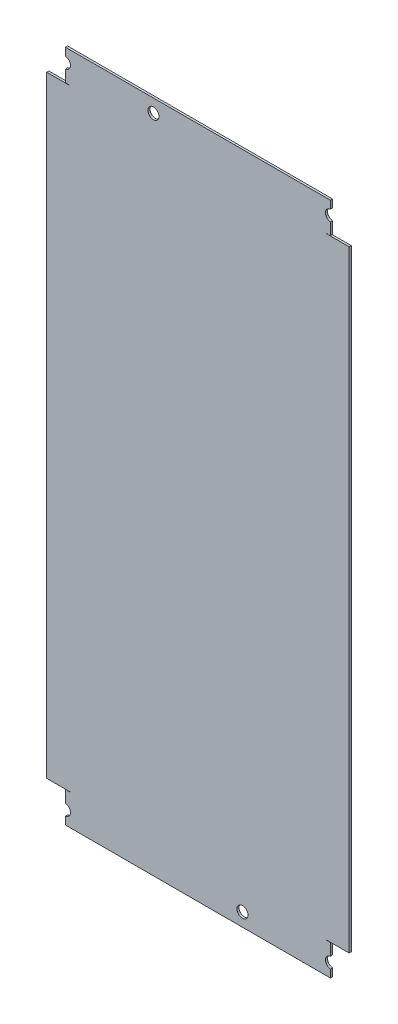
ISO-10303-21;
HEADER;
FILE_DESCRIPTION(('STEP AP214'),'2;1');
FILE_NAME('part.step','',(''),(''),'','','');
FILE_SCHEMA(('AUTOMOTIVE_DESIGN { 1 0 10303 214 1 1 1 1 }'));
ENDSEC;
DATA;
#1=APPLICATION_CONTEXT('core data for automotive mechanical design processes');
#2=APPLICATION_PROTOCOL_DEFINITION('international standard','automotive_design',2000,#1);
#3=PRODUCT_CONTEXT('',#1,'mechanical');
#4=PRODUCT('Part','Part','',(#3));
#5=PRODUCT_RELATED_PRODUCT_CATEGORY('part','',(#4));
#6=PRODUCT_DEFINITION_FORMATION('','',#4);
#7=PRODUCT_DEFINITION_CONTEXT('part definition',#1,'design');
#8=PRODUCT_DEFINITION('design','',#6,#7);
#9=PRODUCT_DEFINITION_SHAPE('','',#8);
#10=(LENGTH_UNIT() NAMED_UNIT(*) SI_UNIT(.MILLI.,.METRE.));
#11=(NAMED_UNIT(*) PLANE_ANGLE_UNIT() SI_UNIT($,.RADIAN.));
#12=(NAMED_UNIT(*) SI_UNIT($,.STERADIAN.) SOLID_ANGLE_UNIT());
#13=UNCERTAINTY_MEASURE_WITH_UNIT(LENGTH_MEASURE(1.E-05),#10,'distance_accuracy_value','');
#14=(GEOMETRIC_REPRESENTATION_CONTEXT(3) GLOBAL_UNCERTAINTY_ASSIGNED_CONTEXT((#13)) GLOBAL_UNIT_ASSIGNED_CONTEXT((#10,
#11,#12)) REPRESENTATION_CONTEXT('',''));
#15=CARTESIAN_POINT('',(0.,0.,0.));
#16=DIRECTION('',(0.,0.,1.));
#17=DIRECTION('',(1.,0.,0.));
#18=AXIS2_PLACEMENT_3D('',#15,#16,#17);
#19=CARTESIAN_POINT('',(0.,0.,-1.524));
#20=DIRECTION('',(0.,0.,-1.));
#21=DIRECTION('',(-1.,0.,0.));
#22=AXIS2_PLACEMENT_3D('',#19,#20,#21);
#23=PLANE('',#22);
#24=CARTESIAN_POINT('',(31.877,-231.775,-1.524));
#25=DIRECTION('',(0.,0.,1.));
#26=DIRECTION('',(1.,0.,0.));
#27=AXIS2_PLACEMENT_3D('',#24,#25,#26);
#28=CIRCLE('',#27,3.96240000000001);
#29=CARTESIAN_POINT('',(35.8394,-231.775,-1.524));
#30=VERTEX_POINT('',#29);
#31=EDGE_CURVE('E504',#30,#30,#28,.T.);
#32=ORIENTED_EDGE('',*,*,#31,.T.);
#33=EDGE_LOOP('',(#32));
#34=FACE_BOUND('',#33,.T.);
#35=CARTESIAN_POINT('',(-31.877,231.775,-1.524));
#36=DIRECTION('',(0.,0.,1.));
#37=DIRECTION('',(1.,0.,0.));
#38=AXIS2_PLACEMENT_3D('',#35,#36,#37);
#39=CIRCLE('',#38,3.96240000000001);
#40=CARTESIAN_POINT('',(-27.9146,231.775,-1.524));
#41=VERTEX_POINT('',#40);
#42=EDGE_CURVE('E512',#41,#41,#39,.T.);
#43=ORIENTED_EDGE('',*,*,#42,.T.);
#44=EDGE_LOOP('',(#43));
#45=FACE_BOUND('',#44,.T.);
#46=DIRECTION('',(0.,1.,0.));
#47=VECTOR('',#46,1.);
#48=CARTESIAN_POINT('',(94.869,-241.3,-1.524));
#49=LINE('',#48,#47);
#50=CARTESIAN_POINT('',(94.869,235.716503875426,-1.52400000000002));
#51=VERTEX_POINT('',#50);
#52=CARTESIAN_POINT('',(94.869,241.3,-1.524));
#53=VERTEX_POINT('',#52);
#54=EDGE_CURVE('E526',#51,#53,#49,.T.);
#55=ORIENTED_EDGE('',*,*,#54,.F.);
#56=CARTESIAN_POINT('',(95.2754000000001,231.775,-1.52400000000002));
#57=DIRECTION('',(0.,0.,1.));
#58=DIRECTION('',(1.,0.,0.));
#59=AXIS2_PLACEMENT_3D('',#56,#57,#58);
#60=CIRCLE('',#59,3.9624);
#61=CARTESIAN_POINT('',(94.869,227.833496124574,-1.52400000000002));
#62=VERTEX_POINT('',#61);
#63=EDGE_CURVE('E354',#62,#51,#60,.F.);
#64=ORIENTED_EDGE('',*,*,#63,.F.);
#65=CARTESIAN_POINT('',(94.869,219.2274,-1.524));
#66=VERTEX_POINT('',#65);
#67=EDGE_CURVE('E527',#66,#62,#49,.T.);
#68=ORIENTED_EDGE('',*,*,#67,.F.);
#69=DIRECTION('',(-1.,0.,0.));
#70=VECTOR('',#69,1.);
#71=CARTESIAN_POINT('',(0.,219.2274,-1.524));
#72=LINE('',#71,#70);
#73=CARTESIAN_POINT('',(91.6686,219.2274,-1.524));
#74=VERTEX_POINT('',#73);
#75=EDGE_CURVE('E500',#66,#74,#72,.T.);
#76=ORIENTED_EDGE('',*,*,#75,.T.);
#77=DIRECTION('',(0.,-1.,0.));
#78=VECTOR('',#77,1.);
#79=CARTESIAN_POINT('',(91.6686,0.,-1.524));
#80=LINE('',#79,#78);
#81=CARTESIAN_POINT('',(91.6686,219.075,-1.524));
#82=VERTEX_POINT('',#81);
#83=EDGE_CURVE('E497',#74,#82,#80,.T.);
#84=ORIENTED_EDGE('',*,*,#83,.T.);
#85=DIRECTION('',(1.,0.,0.));
#86=VECTOR('',#85,1.);
#87=CARTESIAN_POINT('',(0.,219.075,-1.524));
#88=LINE('',#87,#86);
#89=CARTESIAN_POINT('',(108.317962531012,219.075,-1.52400000000008));
#90=VERTEX_POINT('',#89);
#91=EDGE_CURVE('E494',#82,#90,#88,.T.);
#92=ORIENTED_EDGE('',*,*,#91,.T.);
#93=DIRECTION('',(0.,-1.,0.));
#94=VECTOR('',#93,1.);
#95=CARTESIAN_POINT('',(108.317962531012,0.,-1.52400000000009));
#96=LINE('',#95,#94);
#97=CARTESIAN_POINT('',(108.317962531012,-219.075,-1.52400000000011));
#98=VERTEX_POINT('',#97);
#99=EDGE_CURVE('E299',#90,#98,#96,.T.);
#100=ORIENTED_EDGE('',*,*,#99,.T.);
#101=DIRECTION('',(-1.,0.,0.));
#102=VECTOR('',#101,1.);
#103=CARTESIAN_POINT('',(0.,-219.075,-1.524));
#104=LINE('',#103,#102);
#105=CARTESIAN_POINT('',(91.6686,-219.075,-1.524));
#106=VERTEX_POINT('',#105);
#107=EDGE_CURVE('E491',#98,#106,#104,.T.);
#108=ORIENTED_EDGE('',*,*,#107,.T.);
#109=DIRECTION('',(0.,-1.,0.));
#110=VECTOR('',#109,1.);
#111=CARTESIAN_POINT('',(91.6686,0.,-1.524));
#112=LINE('',#111,#110);
#113=CARTESIAN_POINT('',(91.6686,-219.2274,-1.524));
#114=VERTEX_POINT('',#113);
#115=EDGE_CURVE('E488',#106,#114,#112,.T.);
#116=ORIENTED_EDGE('',*,*,#115,.T.);
#117=DIRECTION('',(1.,0.,0.));
#118=VECTOR('',#117,1.);
#119=CARTESIAN_POINT('',(0.,-219.2274,-1.524));
#120=LINE('',#119,#118);
#121=CARTESIAN_POINT('',(94.869,-219.2274,-1.524));
#122=VERTEX_POINT('',#121);
#123=EDGE_CURVE('E452',#114,#122,#120,.T.);
#124=ORIENTED_EDGE('',*,*,#123,.T.);
#125=CARTESIAN_POINT('',(94.869,-227.833496124573,-1.52400000000002));
#126=VERTEX_POINT('',#125);
#127=EDGE_CURVE('E525',#126,#122,#49,.T.);
#128=ORIENTED_EDGE('',*,*,#127,.F.);
#129=CARTESIAN_POINT('',(95.2753999999999,-231.775,-1.52400000000002));
#130=DIRECTION('',(0.,0.,1.));
#131=DIRECTION('',(1.,0.,0.));
#132=AXIS2_PLACEMENT_3D('',#129,#130,#131);
#133=CIRCLE('',#132,3.96240000000001);
#134=CARTESIAN_POINT('',(94.869,-235.716503875426,-1.52400000000002));
#135=VERTEX_POINT('',#134);
#136=EDGE_CURVE('E340',#135,#126,#133,.F.);
#137=ORIENTED_EDGE('',*,*,#136,.F.);
#138=CARTESIAN_POINT('',(94.869,-241.3,-1.524));
#139=VERTEX_POINT('',#138);
#140=EDGE_CURVE('E520',#139,#135,#49,.T.);
#141=ORIENTED_EDGE('',*,*,#140,.F.);
#142=DIRECTION('',(1.,0.,0.));
#143=VECTOR('',#142,1.);
#144=CARTESIAN_POINT('',(-94.869,-241.3,-1.524));
#145=LINE('',#144,#143);
#146=CARTESIAN_POINT('',(-94.869,-241.3,-1.524));
#147=VERTEX_POINT('',#146);
#148=EDGE_CURVE('E536',#147,#139,#145,.T.);
#149=ORIENTED_EDGE('',*,*,#148,.F.);
#150=DIRECTION('',(0.,-1.,0.));
#151=VECTOR('',#150,1.);
#152=CARTESIAN_POINT('',(-94.869,-241.3,-1.524));
#153=LINE('',#152,#151);
#154=CARTESIAN_POINT('',(-94.869,-235.716503875426,-1.52400000000002));
#155=VERTEX_POINT('',#154);
#156=EDGE_CURVE('E531',#155,#147,#153,.T.);
#157=ORIENTED_EDGE('',*,*,#156,.F.);
#158=CARTESIAN_POINT('',(-95.2754,-231.775,-1.52400000000002));
#159=DIRECTION('',(0.,0.,1.));
#160=DIRECTION('',(1.,0.,0.));
#161=AXIS2_PLACEMENT_3D('',#158,#159,#160);
#162=CIRCLE('',#161,3.96240000000001);
#163=CARTESIAN_POINT('',(-94.869,-227.833496124574,-1.52400000000002));
#164=VERTEX_POINT('',#163);
#165=EDGE_CURVE('E327',#155,#164,#162,.T.);
#166=ORIENTED_EDGE('',*,*,#165,.T.);
#167=CARTESIAN_POINT('',(-94.869,-219.2274,-1.524));
#168=VERTEX_POINT('',#167);
#169=EDGE_CURVE('E538',#168,#164,#153,.T.);
#170=ORIENTED_EDGE('',*,*,#169,.F.);
#171=DIRECTION('',(1.,0.,0.));
#172=VECTOR('',#171,1.);
#173=CARTESIAN_POINT('',(0.,-219.2274,-1.524));
#174=LINE('',#173,#172);
#175=CARTESIAN_POINT('',(-91.6686,-219.2274,-1.524));
#176=VERTEX_POINT('',#175);
#177=EDGE_CURVE('E428',#168,#176,#174,.T.);
#178=ORIENTED_EDGE('',*,*,#177,.T.);
#179=DIRECTION('',(0.,1.,0.));
#180=VECTOR('',#179,1.);
#181=CARTESIAN_POINT('',(-91.6686,0.,-1.524));
#182=LINE('',#181,#180);
#183=CARTESIAN_POINT('',(-91.6686,-219.075,-1.524));
#184=VERTEX_POINT('',#183);
#185=EDGE_CURVE('E443',#176,#184,#182,.T.);
#186=ORIENTED_EDGE('',*,*,#185,.T.);
#187=DIRECTION('',(-1.,0.,0.));
#188=VECTOR('',#187,1.);
#189=CARTESIAN_POINT('',(0.,-219.075,-1.524));
#190=LINE('',#189,#188);
#191=CARTESIAN_POINT('',(-108.317962531012,-219.075,-1.52400000000014));
#192=VERTEX_POINT('',#191);
#193=EDGE_CURVE('E440',#184,#192,#190,.T.);
#194=ORIENTED_EDGE('',*,*,#193,.T.);
#195=DIRECTION('',(0.,1.,0.));
#196=VECTOR('',#195,1.);
#197=CARTESIAN_POINT('',(-108.317962531012,0.,-1.52400000000012));
#198=LINE('',#197,#196);
#199=CARTESIAN_POINT('',(-108.317962531012,219.075,-1.52400000000011));
#200=VERTEX_POINT('',#199);
#201=EDGE_CURVE('E314',#192,#200,#198,.T.);
#202=ORIENTED_EDGE('',*,*,#201,.T.);
#203=DIRECTION('',(1.,0.,0.));
#204=VECTOR('',#203,1.);
#205=CARTESIAN_POINT('',(0.,219.075,-1.524));
#206=LINE('',#205,#204);
#207=CARTESIAN_POINT('',(-91.6686,219.075,-1.524));
#208=VERTEX_POINT('',#207);
#209=EDGE_CURVE('E436',#200,#208,#206,.T.);
#210=ORIENTED_EDGE('',*,*,#209,.T.);
#211=DIRECTION('',(0.,1.,0.));
#212=VECTOR('',#211,1.);
#213=CARTESIAN_POINT('',(-91.6686,0.,-1.524));
#214=LINE('',#213,#212);
#215=CARTESIAN_POINT('',(-91.6686,219.2274,-1.524));
#216=VERTEX_POINT('',#215);
#217=EDGE_CURVE('E432',#208,#216,#214,.T.);
#218=ORIENTED_EDGE('',*,*,#217,.T.);
#219=DIRECTION('',(-1.,0.,0.));
#220=VECTOR('',#219,1.);
#221=CARTESIAN_POINT('',(0.,219.2274,-1.524));
#222=LINE('',#221,#220);
#223=CARTESIAN_POINT('',(-94.869,219.2274,-1.524));
#224=VERTEX_POINT('',#223);
#225=EDGE_CURVE('E382',#216,#224,#222,.T.);
#226=ORIENTED_EDGE('',*,*,#225,.T.);
#227=CARTESIAN_POINT('',(-94.869,227.833496124574,-1.52400000000002));
#228=VERTEX_POINT('',#227);
#229=EDGE_CURVE('E537',#228,#224,#153,.T.);
#230=ORIENTED_EDGE('',*,*,#229,.F.);
#231=CARTESIAN_POINT('',(-95.2754,231.775,-1.52400000000002));
#232=DIRECTION('',(0.,0.,1.));
#233=DIRECTION('',(1.,0.,0.));
#234=AXIS2_PLACEMENT_3D('',#231,#232,#233);
#235=CIRCLE('',#234,3.96240000000001);
#236=CARTESIAN_POINT('',(-94.869,235.716503875426,-1.52400000000002));
#237=VERTEX_POINT('',#236);
#238=EDGE_CURVE('E365',#228,#237,#235,.T.);
#239=ORIENTED_EDGE('',*,*,#238,.T.);
#240=CARTESIAN_POINT('',(-94.869,241.3,-1.524));
#241=VERTEX_POINT('',#240);
#242=EDGE_CURVE('E532',#241,#237,#153,.T.);
#243=ORIENTED_EDGE('',*,*,#242,.F.);
#244=DIRECTION('',(-1.,0.,0.));
#245=VECTOR('',#244,1.);
#246=CARTESIAN_POINT('',(-94.869,241.3,-1.524));
#247=LINE('',#246,#245);
#248=EDGE_CURVE('E524',#53,#241,#247,.T.);
#249=ORIENTED_EDGE('',*,*,#248,.F.);
#250=EDGE_LOOP('',(#55,#64,#68,#76,#84,#92,#100,#108,#116,#124,#128,#137,#141,#149,#157,#166,
#170,#178,#186,#194,#202,#210,#218,#226,#230,#239,#243,#249));
#251=FACE_BOUND('',#250,.T.);
#252=ADVANCED_FACE('F91',(#34,#45,#251),#23,.T.);
#253=CARTESIAN_POINT('',(0.,0.,0.));
#254=DIRECTION('',(0.,0.,-1.));
#255=DIRECTION('',(-1.,0.,0.));
#256=AXIS2_PLACEMENT_3D('',#253,#254,#255);
#257=PLANE('',#256);
#258=CARTESIAN_POINT('',(31.877,-231.775,0.));
#259=DIRECTION('',(0.,0.,1.));
#260=DIRECTION('',(1.,0.,0.));
#261=AXIS2_PLACEMENT_3D('',#258,#259,#260);
#262=CIRCLE('',#261,3.96240000000001);
#263=CARTESIAN_POINT('',(35.8394,-231.775,0.));
#264=VERTEX_POINT('',#263);
#265=EDGE_CURVE('E503',#264,#264,#262,.T.);
#266=ORIENTED_EDGE('',*,*,#265,.F.);
#267=EDGE_LOOP('',(#266));
#268=FACE_BOUND('',#267,.T.);
#269=CARTESIAN_POINT('',(-31.877,231.775,0.));
#270=DIRECTION('',(0.,0.,1.));
#271=DIRECTION('',(1.,0.,0.));
#272=AXIS2_PLACEMENT_3D('',#269,#270,#271);
#273=CIRCLE('',#272,3.96240000000001);
#274=CARTESIAN_POINT('',(-27.9146,231.775,0.));
#275=VERTEX_POINT('',#274);
#276=EDGE_CURVE('E508',#275,#275,#273,.T.);
#277=ORIENTED_EDGE('',*,*,#276,.F.);
#278=EDGE_LOOP('',(#277));
#279=FACE_BOUND('',#278,.T.);
#280=CARTESIAN_POINT('',(95.2754000000001,231.775,0.));
#281=DIRECTION('',(0.,0.,1.));
#282=DIRECTION('',(1.,0.,0.));
#283=AXIS2_PLACEMENT_3D('',#280,#281,#282);
#284=CIRCLE('',#283,3.9624);
#285=CARTESIAN_POINT('',(94.869,227.833496124574,0.));
#286=VERTEX_POINT('',#285);
#287=CARTESIAN_POINT('',(94.869,235.716503875426,0.));
#288=VERTEX_POINT('',#287);
#289=EDGE_CURVE('E313',#286,#288,#284,.F.);
#290=ORIENTED_EDGE('',*,*,#289,.T.);
#291=DIRECTION('',(0.,1.,0.));
#292=VECTOR('',#291,1.);
#293=CARTESIAN_POINT('',(94.869,-241.3,0.));
#294=LINE('',#293,#292);
#295=CARTESIAN_POINT('',(94.869,241.3,0.));
#296=VERTEX_POINT('',#295);
#297=EDGE_CURVE('E516',#288,#296,#294,.T.);
#298=ORIENTED_EDGE('',*,*,#297,.T.);
#299=DIRECTION('',(-1.,0.,0.));
#300=VECTOR('',#299,1.);
#301=CARTESIAN_POINT('',(-94.869,241.3,0.));
#302=LINE('',#301,#300);
#303=CARTESIAN_POINT('',(-94.869,241.3,0.));
#304=VERTEX_POINT('',#303);
#305=EDGE_CURVE('E546',#296,#304,#302,.T.);
#306=ORIENTED_EDGE('',*,*,#305,.T.);
#307=DIRECTION('',(0.,-1.,0.));
#308=VECTOR('',#307,1.);
#309=CARTESIAN_POINT('',(-94.869,-241.3,0.));
#310=LINE('',#309,#308);
#311=CARTESIAN_POINT('',(-94.869,235.716503875426,0.));
#312=VERTEX_POINT('',#311);
#313=EDGE_CURVE('E553',#304,#312,#310,.T.);
#314=ORIENTED_EDGE('',*,*,#313,.T.);
#315=CARTESIAN_POINT('',(-95.2754,231.775,0.));
#316=DIRECTION('',(0.,0.,1.));
#317=DIRECTION('',(1.,0.,0.));
#318=AXIS2_PLACEMENT_3D('',#315,#316,#317);
#319=CIRCLE('',#318,3.96240000000001);
#320=CARTESIAN_POINT('',(-94.869,227.833496124574,0.));
#321=VERTEX_POINT('',#320);
#322=EDGE_CURVE('E117',#321,#312,#319,.T.);
#323=ORIENTED_EDGE('',*,*,#322,.F.);
#324=CARTESIAN_POINT('',(-94.869,219.2274,0.));
#325=VERTEX_POINT('',#324);
#326=EDGE_CURVE('E558',#321,#325,#310,.T.);
#327=ORIENTED_EDGE('',*,*,#326,.T.);
#328=DIRECTION('',(-1.,0.,0.));
#329=VECTOR('',#328,1.);
#330=CARTESIAN_POINT('',(-91.6686,219.2274,0.));
#331=LINE('',#330,#329);
#332=CARTESIAN_POINT('',(-91.6686,219.2274,0.));
#333=VERTEX_POINT('',#332);
#334=EDGE_CURVE('E402',#333,#325,#331,.T.);
#335=ORIENTED_EDGE('',*,*,#334,.F.);
#336=DIRECTION('',(0.,1.,0.));
#337=VECTOR('',#336,1.);
#338=CARTESIAN_POINT('',(-91.6686,219.075,0.));
#339=LINE('',#338,#337);
#340=CARTESIAN_POINT('',(-91.6686,219.075,0.));
#341=VERTEX_POINT('',#340);
#342=EDGE_CURVE('E397',#341,#333,#339,.T.);
#343=ORIENTED_EDGE('',*,*,#342,.F.);
#344=DIRECTION('',(1.,0.,0.));
#345=VECTOR('',#344,1.);
#346=CARTESIAN_POINT('',(-91.821,219.075,0.));
#347=LINE('',#346,#345);
#348=CARTESIAN_POINT('',(-108.317962531012,219.075,-1.11022302462516E-13));
#349=VERTEX_POINT('',#348);
#350=EDGE_CURVE('E393',#349,#341,#347,.T.);
#351=ORIENTED_EDGE('',*,*,#350,.F.);
#352=DIRECTION('',(0.,-1.,0.));
#353=VECTOR('',#352,1.);
#354=CARTESIAN_POINT('',(-108.317962531012,219.075,-1.11022302462516E-13));
#355=LINE('',#354,#353);
#356=CARTESIAN_POINT('',(-108.317962531012,-219.075,-1.38777878078145E-13));
#357=VERTEX_POINT('',#356);
#358=EDGE_CURVE('E322',#357,#349,#355,.F.);
#359=ORIENTED_EDGE('',*,*,#358,.F.);
#360=DIRECTION('',(-1.,0.,0.));
#361=VECTOR('',#360,1.);
#362=CARTESIAN_POINT('',(-91.6686,-219.075,0.));
#363=LINE('',#362,#361);
#364=CARTESIAN_POINT('',(-91.6686,-219.075,0.));
#365=VERTEX_POINT('',#364);
#366=EDGE_CURVE('E389',#365,#357,#363,.T.);
#367=ORIENTED_EDGE('',*,*,#366,.F.);
#368=DIRECTION('',(0.,1.,0.));
#369=VECTOR('',#368,1.);
#370=CARTESIAN_POINT('',(-91.6686,-219.2274,0.));
#371=LINE('',#370,#369);
#372=CARTESIAN_POINT('',(-91.6686,-219.2274,0.));
#373=VERTEX_POINT('',#372);
#374=EDGE_CURVE('E384',#373,#365,#371,.T.);
#375=ORIENTED_EDGE('',*,*,#374,.F.);
#376=DIRECTION('',(1.,0.,0.));
#377=VECTOR('',#376,1.);
#378=CARTESIAN_POINT('',(-94.869,-219.2274,0.));
#379=LINE('',#378,#377);
#380=CARTESIAN_POINT('',(-94.869,-219.2274,0.));
#381=VERTEX_POINT('',#380);
#382=EDGE_CURVE('E378',#381,#373,#379,.T.);
#383=ORIENTED_EDGE('',*,*,#382,.F.);
#384=CARTESIAN_POINT('',(-94.869,-227.833496124574,0.));
#385=VERTEX_POINT('',#384);
#386=EDGE_CURVE('E559',#381,#385,#310,.T.);
#387=ORIENTED_EDGE('',*,*,#386,.T.);
#388=CARTESIAN_POINT('',(-95.2754,-231.775,0.));
#389=DIRECTION('',(0.,0.,1.));
#390=DIRECTION('',(1.,0.,0.));
#391=AXIS2_PLACEMENT_3D('',#388,#389,#390);
#392=CIRCLE('',#391,3.96240000000001);
#393=CARTESIAN_POINT('',(-94.869,-235.716503875426,0.));
#394=VERTEX_POINT('',#393);
#395=EDGE_CURVE('E109',#394,#385,#392,.T.);
#396=ORIENTED_EDGE('',*,*,#395,.F.);
#397=CARTESIAN_POINT('',(-94.869,-241.3,0.));
#398=VERTEX_POINT('',#397);
#399=EDGE_CURVE('E552',#394,#398,#310,.T.);
#400=ORIENTED_EDGE('',*,*,#399,.T.);
#401=DIRECTION('',(1.,0.,0.));
#402=VECTOR('',#401,1.);
#403=CARTESIAN_POINT('',(-94.869,-241.3,0.));
#404=LINE('',#403,#402);
#405=CARTESIAN_POINT('',(94.869,-241.3,0.));
#406=VERTEX_POINT('',#405);
#407=EDGE_CURVE('E557',#398,#406,#404,.T.);
#408=ORIENTED_EDGE('',*,*,#407,.T.);
#409=CARTESIAN_POINT('',(94.869,-235.716503875426,0.));
#410=VERTEX_POINT('',#409);
#411=EDGE_CURVE('E542',#406,#410,#294,.T.);
#412=ORIENTED_EDGE('',*,*,#411,.T.);
#413=CARTESIAN_POINT('',(95.2753999999999,-231.775,0.));
#414=DIRECTION('',(0.,0.,1.));
#415=DIRECTION('',(1.,0.,0.));
#416=AXIS2_PLACEMENT_3D('',#413,#414,#415);
#417=CIRCLE('',#416,3.96240000000001);
#418=CARTESIAN_POINT('',(94.869,-227.833496124573,0.));
#419=VERTEX_POINT('',#418);
#420=EDGE_CURVE('E344',#410,#419,#417,.F.);
#421=ORIENTED_EDGE('',*,*,#420,.T.);
#422=CARTESIAN_POINT('',(94.869,-219.2274,0.));
#423=VERTEX_POINT('',#422);
#424=EDGE_CURVE('E547',#419,#423,#294,.T.);
#425=ORIENTED_EDGE('',*,*,#424,.T.);
#426=DIRECTION('',(1.,0.,0.));
#427=VECTOR('',#426,1.);
#428=CARTESIAN_POINT('',(91.6686,-219.2274,0.));
#429=LINE('',#428,#427);
#430=CARTESIAN_POINT('',(91.6686,-219.2274,0.));
#431=VERTEX_POINT('',#430);
#432=EDGE_CURVE('E464',#431,#423,#429,.T.);
#433=ORIENTED_EDGE('',*,*,#432,.F.);
#434=DIRECTION('',(0.,-1.,0.));
#435=VECTOR('',#434,1.);
#436=CARTESIAN_POINT('',(91.6686,-219.075,0.));
#437=LINE('',#436,#435);
#438=CARTESIAN_POINT('',(91.6686,-219.075,0.));
#439=VERTEX_POINT('',#438);
#440=EDGE_CURVE('E459',#439,#431,#437,.T.);
#441=ORIENTED_EDGE('',*,*,#440,.F.);
#442=DIRECTION('',(-1.,0.,0.));
#443=VECTOR('',#442,1.);
#444=CARTESIAN_POINT('',(91.821,-219.075,0.));
#445=LINE('',#444,#443);
#446=CARTESIAN_POINT('',(108.317962531012,-219.075,-1.11022302462516E-13));
#447=VERTEX_POINT('',#446);
#448=EDGE_CURVE('E304',#447,#439,#445,.T.);
#449=ORIENTED_EDGE('',*,*,#448,.F.);
#450=DIRECTION('',(0.,1.,0.));
#451=VECTOR('',#450,1.);
#452=CARTESIAN_POINT('',(108.317962531012,-219.075,-1.11022302462516E-13));
#453=LINE('',#452,#451);
#454=CARTESIAN_POINT('',(108.317962531012,219.075,0.));
#455=VERTEX_POINT('',#454);
#456=EDGE_CURVE('E296',#455,#447,#453,.F.);
#457=ORIENTED_EDGE('',*,*,#456,.F.);
#458=DIRECTION('',(1.,0.,0.));
#459=VECTOR('',#458,1.);
#460=CARTESIAN_POINT('',(91.6686,219.075,0.));
#461=LINE('',#460,#459);
#462=CARTESIAN_POINT('',(91.6686,219.075,0.));
#463=VERTEX_POINT('',#462);
#464=EDGE_CURVE('E278',#463,#455,#461,.T.);
#465=ORIENTED_EDGE('',*,*,#464,.F.);
#466=DIRECTION('',(0.,-1.,0.));
#467=VECTOR('',#466,1.);
#468=CARTESIAN_POINT('',(91.6686,219.2274,0.));
#469=LINE('',#468,#467);
#470=CARTESIAN_POINT('',(91.6686,219.2274,0.));
#471=VERTEX_POINT('',#470);
#472=EDGE_CURVE('E454',#471,#463,#469,.T.);
#473=ORIENTED_EDGE('',*,*,#472,.F.);
#474=DIRECTION('',(-1.,0.,0.));
#475=VECTOR('',#474,1.);
#476=CARTESIAN_POINT('',(94.869,219.2274,0.));
#477=LINE('',#476,#475);
#478=CARTESIAN_POINT('',(94.869,219.2274,0.));
#479=VERTEX_POINT('',#478);
#480=EDGE_CURVE('E448',#479,#471,#477,.T.);
#481=ORIENTED_EDGE('',*,*,#480,.F.);
#482=EDGE_CURVE('E548',#479,#286,#294,.T.);
#483=ORIENTED_EDGE('',*,*,#482,.T.);
#484=EDGE_LOOP('',(#290,#298,#306,#314,#323,#327,#335,#343,#351,#359,#367,#375,#383,#387,#396,
#400,#408,#412,#421,#425,#433,#441,#449,#457,#465,#473,#481,#483));
#485=FACE_BOUND('',#484,.T.);
#486=ADVANCED_FACE('F93',(#268,#279,#485),#257,.F.);
#487=CARTESIAN_POINT('',(-94.869,-241.3,-1.524));
#488=DIRECTION('',(-1.,0.,0.));
#489=DIRECTION('',(0.,0.,1.));
#490=AXIS2_PLACEMENT_3D('',#487,#488,#489);
#491=PLANE('',#490);
#492=DIRECTION('',(0.,0.,1.));
#493=VECTOR('',#492,1.);
#494=CARTESIAN_POINT('',(-94.869,-235.716503875426,-1.52400000000002));
#495=LINE('',#494,#493);
#496=EDGE_CURVE('E331',#155,#394,#495,.T.);
#497=ORIENTED_EDGE('',*,*,#496,.F.);
#498=ORIENTED_EDGE('',*,*,#156,.T.);
#499=DIRECTION('',(0.,0.,1.));
#500=VECTOR('',#499,1.);
#501=CARTESIAN_POINT('',(-94.869,-241.3,-1.524));
#502=LINE('',#501,#500);
#503=EDGE_CURVE('E101',#147,#398,#502,.T.);
#504=ORIENTED_EDGE('',*,*,#503,.T.);
#505=ORIENTED_EDGE('',*,*,#399,.F.);
#506=EDGE_LOOP('',(#497,#498,#504,#505));
#507=FACE_BOUND('',#506,.T.);
#508=ADVANCED_FACE('F630',(#507),#491,.T.);
#509=DIRECTION('',(0.,0.,1.));
#510=VECTOR('',#509,1.);
#511=CARTESIAN_POINT('',(-94.869,227.833496124574,-1.52400000000002));
#512=LINE('',#511,#510);
#513=EDGE_CURVE('E369',#228,#321,#512,.T.);
#514=ORIENTED_EDGE('',*,*,#513,.F.);
#515=ORIENTED_EDGE('',*,*,#229,.T.);
#516=DIRECTION('',(0.,0.,-1.));
#517=VECTOR('',#516,1.);
#518=CARTESIAN_POINT('',(-94.869,219.2274,0.));
#519=LINE('',#518,#517);
#520=EDGE_CURVE('E406',#325,#224,#519,.T.);
#521=ORIENTED_EDGE('',*,*,#520,.F.);
#522=ORIENTED_EDGE('',*,*,#326,.F.);
#523=EDGE_LOOP('',(#514,#515,#521,#522));
#524=FACE_BOUND('',#523,.T.);
#525=ADVANCED_FACE('F651',(#524),#491,.T.);
#526=CARTESIAN_POINT('',(94.869,-241.3,-1.524));
#527=DIRECTION('',(1.,0.,0.));
#528=DIRECTION('',(0.,0.,-1.));
#529=AXIS2_PLACEMENT_3D('',#526,#527,#528);
#530=PLANE('',#529);
#531=ORIENTED_EDGE('',*,*,#297,.F.);
#532=DIRECTION('',(0.,0.,1.));
#533=VECTOR('',#532,1.);
#534=CARTESIAN_POINT('',(94.869,235.716503875426,-1.52400000000002));
#535=LINE('',#534,#533);
#536=EDGE_CURVE('E348',#51,#288,#535,.T.);
#537=ORIENTED_EDGE('',*,*,#536,.F.);
#538=ORIENTED_EDGE('',*,*,#54,.T.);
#539=DIRECTION('',(0.,0.,1.));
#540=VECTOR('',#539,1.);
#541=CARTESIAN_POINT('',(94.869,241.3,-1.524));
#542=LINE('',#541,#540);
#543=EDGE_CURVE('E95',#53,#296,#542,.T.);
#544=ORIENTED_EDGE('',*,*,#543,.T.);
#545=EDGE_LOOP('',(#531,#537,#538,#544));
#546=FACE_BOUND('',#545,.T.);
#547=ADVANCED_FACE('F575',(#546),#530,.T.);
#548=ORIENTED_EDGE('',*,*,#67,.T.);
#549=DIRECTION('',(0.,0.,1.));
#550=VECTOR('',#549,1.);
#551=CARTESIAN_POINT('',(94.869,227.833496124574,-1.52400000000002));
#552=LINE('',#551,#550);
#553=EDGE_CURVE('E357',#62,#286,#552,.T.);
#554=ORIENTED_EDGE('',*,*,#553,.T.);
#555=ORIENTED_EDGE('',*,*,#482,.F.);
#556=DIRECTION('',(0.,0.,-1.));
#557=VECTOR('',#556,1.);
#558=CARTESIAN_POINT('',(94.869,219.2274,0.));
#559=LINE('',#558,#557);
#560=EDGE_CURVE('E453',#479,#66,#559,.T.);
#561=ORIENTED_EDGE('',*,*,#560,.T.);
#562=EDGE_LOOP('',(#548,#554,#555,#561));
#563=FACE_BOUND('',#562,.T.);
#564=ADVANCED_FACE('F613',(#563),#530,.T.);
#565=ORIENTED_EDGE('',*,*,#424,.F.);
#566=DIRECTION('',(0.,0.,1.));
#567=VECTOR('',#566,1.);
#568=CARTESIAN_POINT('',(94.869,-227.833496124573,-1.52400000000002));
#569=LINE('',#568,#567);
#570=EDGE_CURVE('E334',#126,#419,#569,.T.);
#571=ORIENTED_EDGE('',*,*,#570,.F.);
#572=ORIENTED_EDGE('',*,*,#127,.T.);
#573=DIRECTION('',(0.,0.,-1.));
#574=VECTOR('',#573,1.);
#575=CARTESIAN_POINT('',(94.869,-219.2274,0.));
#576=LINE('',#575,#574);
#577=EDGE_CURVE('E468',#423,#122,#576,.T.);
#578=ORIENTED_EDGE('',*,*,#577,.F.);
#579=EDGE_LOOP('',(#565,#571,#572,#578));
#580=FACE_BOUND('',#579,.T.);
#581=ADVANCED_FACE('F589',(#580),#530,.T.);
#582=ORIENTED_EDGE('',*,*,#140,.T.);
#583=DIRECTION('',(0.,0.,1.));
#584=VECTOR('',#583,1.);
#585=CARTESIAN_POINT('',(94.869,-235.716503875426,-1.52400000000002));
#586=LINE('',#585,#584);
#587=EDGE_CURVE('E343',#135,#410,#586,.T.);
#588=ORIENTED_EDGE('',*,*,#587,.T.);
#589=ORIENTED_EDGE('',*,*,#411,.F.);
#590=DIRECTION('',(0.,0.,1.));
#591=VECTOR('',#590,1.);
#592=CARTESIAN_POINT('',(94.869,-241.3,-1.524));
#593=LINE('',#592,#591);
#594=EDGE_CURVE('E13',#139,#406,#593,.T.);
#595=ORIENTED_EDGE('',*,*,#594,.F.);
#596=EDGE_LOOP('',(#582,#588,#589,#595));
#597=FACE_BOUND('',#596,.T.);
#598=ADVANCED_FACE('F638',(#597),#530,.T.);
#599=DIRECTION('',(0.,0.,1.));
#600=VECTOR('',#599,1.);
#601=CARTESIAN_POINT('',(-94.869,-227.833496124574,-1.52400000000002));
#602=LINE('',#601,#600);
#603=EDGE_CURVE('E335',#164,#385,#602,.T.);
#604=ORIENTED_EDGE('',*,*,#603,.T.);
#605=ORIENTED_EDGE('',*,*,#386,.F.);
#606=DIRECTION('',(0.,0.,-1.));
#607=VECTOR('',#606,1.);
#608=CARTESIAN_POINT('',(-94.869,-219.2274,0.));
#609=LINE('',#608,#607);
#610=EDGE_CURVE('E383',#381,#168,#609,.T.);
#611=ORIENTED_EDGE('',*,*,#610,.T.);
#612=ORIENTED_EDGE('',*,*,#169,.T.);
#613=EDGE_LOOP('',(#604,#605,#611,#612));
#614=FACE_BOUND('',#613,.T.);
#615=ADVANCED_FACE('F678',(#614),#491,.T.);
#616=DIRECTION('',(0.,0.,1.));
#617=VECTOR('',#616,1.);
#618=CARTESIAN_POINT('',(-94.869,235.716503875426,-1.52400000000002));
#619=LINE('',#618,#617);
#620=EDGE_CURVE('E372',#237,#312,#619,.T.);
#621=ORIENTED_EDGE('',*,*,#620,.T.);
#622=ORIENTED_EDGE('',*,*,#313,.F.);
#623=DIRECTION('',(0.,0.,1.));
#624=VECTOR('',#623,1.);
#625=CARTESIAN_POINT('',(-94.869,241.3,-1.524));
#626=LINE('',#625,#624);
#627=EDGE_CURVE('E565',#241,#304,#626,.T.);
#628=ORIENTED_EDGE('',*,*,#627,.F.);
#629=ORIENTED_EDGE('',*,*,#242,.T.);
#630=EDGE_LOOP('',(#621,#622,#628,#629));
#631=FACE_BOUND('',#630,.T.);
#632=ADVANCED_FACE('F705',(#631),#491,.T.);
#633=CARTESIAN_POINT('',(-94.869,-241.3,-1.524));
#634=DIRECTION('',(0.,-1.,0.));
#635=DIRECTION('',(0.,0.,-1.));
#636=AXIS2_PLACEMENT_3D('',#633,#634,#635);
#637=PLANE('',#636);
#638=ORIENTED_EDGE('',*,*,#407,.F.);
#639=ORIENTED_EDGE('',*,*,#503,.F.);
#640=ORIENTED_EDGE('',*,*,#148,.T.);
#641=ORIENTED_EDGE('',*,*,#594,.T.);
#642=EDGE_LOOP('',(#638,#639,#640,#641));
#643=FACE_BOUND('',#642,.T.);
#644=ADVANCED_FACE('F634',(#643),#637,.T.);
#645=CARTESIAN_POINT('',(-94.869,241.3,-1.524));
#646=DIRECTION('',(0.,1.,0.));
#647=DIRECTION('',(0.,0.,1.));
#648=AXIS2_PLACEMENT_3D('',#645,#646,#647);
#649=PLANE('',#648);
#650=ORIENTED_EDGE('',*,*,#305,.F.);
#651=ORIENTED_EDGE('',*,*,#543,.F.);
#652=ORIENTED_EDGE('',*,*,#248,.T.);
#653=ORIENTED_EDGE('',*,*,#627,.T.);
#654=EDGE_LOOP('',(#650,#651,#652,#653));
#655=FACE_BOUND('',#654,.T.);
#656=ADVANCED_FACE('F579',(#655),#649,.T.);
#657=CARTESIAN_POINT('',(-31.877,231.775,-1.524));
#658=DIRECTION('',(0.,0.,1.));
#659=DIRECTION('',(1.,0.,0.));
#660=AXIS2_PLACEMENT_3D('',#657,#658,#659);
#661=CYLINDRICAL_SURFACE('',#660,3.96240000000001);
#662=CARTESIAN_POINT('',(-27.9146,231.775,-1.524));
#663=CARTESIAN_POINT('',(-27.9146,231.775,-1.508125));
#664=CARTESIAN_POINT('',(-27.9146,231.775,-1.49225));
#665=CARTESIAN_POINT('',(-27.9146,231.775,-1.4605));
#666=CARTESIAN_POINT('',(-27.9146,231.775,-1.444625));
#667=CARTESIAN_POINT('',(-27.9146,231.775,-1.412875));
#668=CARTESIAN_POINT('',(-27.9146,231.775,-1.397));
#669=CARTESIAN_POINT('',(-27.9146,231.775,-1.36525));
#670=CARTESIAN_POINT('',(-27.9146,231.775,-1.349375));
#671=CARTESIAN_POINT('',(-27.9146,231.775,-1.317625));
#672=CARTESIAN_POINT('',(-27.9146,231.775,-1.30175));
#673=CARTESIAN_POINT('',(-27.9146,231.775,-1.27));
#674=CARTESIAN_POINT('',(-27.9146,231.775,-1.254125));
#675=CARTESIAN_POINT('',(-27.9146,231.775,-1.222375));
#676=CARTESIAN_POINT('',(-27.9146,231.775,-1.2065));
#677=CARTESIAN_POINT('',(-27.9146,231.775,-1.17475));
#678=CARTESIAN_POINT('',(-27.9146,231.775,-1.158875));
#679=CARTESIAN_POINT('',(-27.9146,231.775,-1.127125));
#680=CARTESIAN_POINT('',(-27.9146,231.775,-1.11125));
#681=CARTESIAN_POINT('',(-27.9146,231.775,-1.0795));
#682=CARTESIAN_POINT('',(-27.9146,231.775,-1.063625));
#683=CARTESIAN_POINT('',(-27.9146,231.775,-1.031875));
#684=CARTESIAN_POINT('',(-27.9146,231.775,-1.016));
#685=CARTESIAN_POINT('',(-27.9146,231.775,-0.98425));
#686=CARTESIAN_POINT('',(-27.9146,231.775,-0.968375));
#687=CARTESIAN_POINT('',(-27.9146,231.775,-0.936625));
#688=CARTESIAN_POINT('',(-27.9146,231.775,-0.92075));
#689=CARTESIAN_POINT('',(-27.9146,231.775,-0.889));
#690=CARTESIAN_POINT('',(-27.9146,231.775,-0.873125));
#691=CARTESIAN_POINT('',(-27.9146,231.775,-0.841375));
#692=CARTESIAN_POINT('',(-27.9146,231.775,-0.8255));
#693=CARTESIAN_POINT('',(-27.9146,231.775,-0.79375));
#694=CARTESIAN_POINT('',(-27.9146,231.775,-0.777875));
#695=CARTESIAN_POINT('',(-27.9146,231.775,-0.746125));
#696=CARTESIAN_POINT('',(-27.9146,231.775,-0.73025));
#697=CARTESIAN_POINT('',(-27.9146,231.775,-0.6985));
#698=CARTESIAN_POINT('',(-27.9146,231.775,-0.682625));
#699=CARTESIAN_POINT('',(-27.9146,231.775,-0.650875));
#700=CARTESIAN_POINT('',(-27.9146,231.775,-0.635));
#701=CARTESIAN_POINT('',(-27.9146,231.775,-0.60325));
#702=CARTESIAN_POINT('',(-27.9146,231.775,-0.587375));
#703=CARTESIAN_POINT('',(-27.9146,231.775,-0.555625));
#704=CARTESIAN_POINT('',(-27.9146,231.775,-0.53975));
#705=CARTESIAN_POINT('',(-27.9146,231.775,-0.508));
#706=CARTESIAN_POINT('',(-27.9146,231.775,-0.492125));
#707=CARTESIAN_POINT('',(-27.9146,231.775,-0.460375));
#708=CARTESIAN_POINT('',(-27.9146,231.775,-0.4445));
#709=CARTESIAN_POINT('',(-27.9146,231.775,-0.41275));
#710=CARTESIAN_POINT('',(-27.9146,231.775,-0.396875));
#711=CARTESIAN_POINT('',(-27.9146,231.775,-0.365125));
#712=CARTESIAN_POINT('',(-27.9146,231.775,-0.34925));
#713=CARTESIAN_POINT('',(-27.9146,231.775,-0.3175));
#714=CARTESIAN_POINT('',(-27.9146,231.775,-0.301625));
#715=CARTESIAN_POINT('',(-27.9146,231.775,-0.269875));
#716=CARTESIAN_POINT('',(-27.9146,231.775,-0.254));
#717=CARTESIAN_POINT('',(-27.9146,231.775,-0.22225));
#718=CARTESIAN_POINT('',(-27.9146,231.775,-0.206375));
#719=CARTESIAN_POINT('',(-27.9146,231.775,-0.174625));
#720=CARTESIAN_POINT('',(-27.9146,231.775,-0.15875));
#721=CARTESIAN_POINT('',(-27.9146,231.775,-0.127));
#722=CARTESIAN_POINT('',(-27.9146,231.775,-0.111125));
#723=CARTESIAN_POINT('',(-27.9146,231.775,-0.079375));
#724=CARTESIAN_POINT('',(-27.9146,231.775,-0.0635));
#725=CARTESIAN_POINT('',(-27.9146,231.775,-0.0317499999999999));
#726=CARTESIAN_POINT('',(-27.9146,231.775,-0.015875));
#727=CARTESIAN_POINT('',(-27.9146,231.775,0.));
#728=B_SPLINE_CURVE_WITH_KNOTS('',3,(#662,#663,#664,#665,#666,#667,#668,#669,#670,#671,#672,
#673,#674,#675,#676,#677,#678,#679,#680,#681,#682,#683,#684,#685,#686,#687,#688,#689,#690,#691,
#692,#693,#694,#695,#696,#697,#698,#699,#700,#701,#702,#703,#704,#705,#706,#707,#708,#709,#710,
#711,#712,#713,#714,#715,#716,#717,#718,#719,#720,#721,#722,#723,#724,#725,#726,#727),
.UNSPECIFIED.,.F.,.F.,(4,2,2,2,2,2,2,2,2,2,2,2,2,2,2,2,2,2,2,2,2,2,2,2,2,2,2,2,2,2,2,2,4),(0.,
0.0476249999999999,0.0952499999999998,0.142875,0.1905,0.238125,0.28575,0.333375,0.381,0.428625,
0.47625,0.523875,0.5715,0.619125,0.66675,0.714375,0.762,0.809625,0.85725,0.904875,0.9525,
1.000125,1.04775,1.095375,1.143,1.190625,1.23825,1.285875,1.3335,1.381125,1.42875,1.476375,
1.524),.UNSPECIFIED.);
#729=EDGE_CURVE('BSEAM701',#41,#275,#728,.T.);
#730=ORIENTED_EDGE('',*,*,#42,.F.);
#731=ORIENTED_EDGE('',*,*,#276,.T.);
#732=ORIENTED_EDGE('',*,*,#729,.T.);
#733=ORIENTED_EDGE('',*,*,#729,.F.);
#734=EDGE_LOOP('',(#730,#732,#731,#733));
#735=FACE_BOUND('',#734,.T.);
#736=ADVANCED_FACE('F701',(#735),#661,.F.);
#737=CARTESIAN_POINT('',(31.877,-231.775,-1.524));
#738=DIRECTION('',(0.,0.,1.));
#739=DIRECTION('',(1.,0.,0.));
#740=AXIS2_PLACEMENT_3D('',#737,#738,#739);
#741=CYLINDRICAL_SURFACE('',#740,3.96240000000001);
#742=CARTESIAN_POINT('',(35.8394,-231.775,-1.524));
#743=CARTESIAN_POINT('',(35.8394,-231.775,-1.508125));
#744=CARTESIAN_POINT('',(35.8394,-231.775,-1.49225));
#745=CARTESIAN_POINT('',(35.8394,-231.775,-1.4605));
#746=CARTESIAN_POINT('',(35.8394,-231.775,-1.444625));
#747=CARTESIAN_POINT('',(35.8394,-231.775,-1.412875));
#748=CARTESIAN_POINT('',(35.8394,-231.775,-1.397));
#749=CARTESIAN_POINT('',(35.8394,-231.775,-1.36525));
#750=CARTESIAN_POINT('',(35.8394,-231.775,-1.349375));
#751=CARTESIAN_POINT('',(35.8394,-231.775,-1.317625));
#752=CARTESIAN_POINT('',(35.8394,-231.775,-1.30175));
#753=CARTESIAN_POINT('',(35.8394,-231.775,-1.27));
#754=CARTESIAN_POINT('',(35.8394,-231.775,-1.254125));
#755=CARTESIAN_POINT('',(35.8394,-231.775,-1.222375));
#756=CARTESIAN_POINT('',(35.8394,-231.775,-1.2065));
#757=CARTESIAN_POINT('',(35.8394,-231.775,-1.17475));
#758=CARTESIAN_POINT('',(35.8394,-231.775,-1.158875));
#759=CARTESIAN_POINT('',(35.8394,-231.775,-1.127125));
#760=CARTESIAN_POINT('',(35.8394,-231.775,-1.11125));
#761=CARTESIAN_POINT('',(35.8394,-231.775,-1.0795));
#762=CARTESIAN_POINT('',(35.8394,-231.775,-1.063625));
#763=CARTESIAN_POINT('',(35.8394,-231.775,-1.031875));
#764=CARTESIAN_POINT('',(35.8394,-231.775,-1.016));
#765=CARTESIAN_POINT('',(35.8394,-231.775,-0.98425));
#766=CARTESIAN_POINT('',(35.8394,-231.775,-0.968375));
#767=CARTESIAN_POINT('',(35.8394,-231.775,-0.936625));
#768=CARTESIAN_POINT('',(35.8394,-231.775,-0.92075));
#769=CARTESIAN_POINT('',(35.8394,-231.775,-0.889));
#770=CARTESIAN_POINT('',(35.8394,-231.775,-0.873125));
#771=CARTESIAN_POINT('',(35.8394,-231.775,-0.841375));
#772=CARTESIAN_POINT('',(35.8394,-231.775,-0.8255));
#773=CARTESIAN_POINT('',(35.8394,-231.775,-0.79375));
#774=CARTESIAN_POINT('',(35.8394,-231.775,-0.777875));
#775=CARTESIAN_POINT('',(35.8394,-231.775,-0.746125));
#776=CARTESIAN_POINT('',(35.8394,-231.775,-0.73025));
#777=CARTESIAN_POINT('',(35.8394,-231.775,-0.6985));
#778=CARTESIAN_POINT('',(35.8394,-231.775,-0.682625));
#779=CARTESIAN_POINT('',(35.8394,-231.775,-0.650875));
#780=CARTESIAN_POINT('',(35.8394,-231.775,-0.635));
#781=CARTESIAN_POINT('',(35.8394,-231.775,-0.60325));
#782=CARTESIAN_POINT('',(35.8394,-231.775,-0.587375));
#783=CARTESIAN_POINT('',(35.8394,-231.775,-0.555625));
#784=CARTESIAN_POINT('',(35.8394,-231.775,-0.53975));
#785=CARTESIAN_POINT('',(35.8394,-231.775,-0.508));
#786=CARTESIAN_POINT('',(35.8394,-231.775,-0.492125));
#787=CARTESIAN_POINT('',(35.8394,-231.775,-0.460375));
#788=CARTESIAN_POINT('',(35.8394,-231.775,-0.4445));
#789=CARTESIAN_POINT('',(35.8394,-231.775,-0.41275));
#790=CARTESIAN_POINT('',(35.8394,-231.775,-0.396875));
#791=CARTESIAN_POINT('',(35.8394,-231.775,-0.365125));
#792=CARTESIAN_POINT('',(35.8394,-231.775,-0.34925));
#793=CARTESIAN_POINT('',(35.8394,-231.775,-0.3175));
#794=CARTESIAN_POINT('',(35.8394,-231.775,-0.301625));
#795=CARTESIAN_POINT('',(35.8394,-231.775,-0.269875));
#796=CARTESIAN_POINT('',(35.8394,-231.775,-0.254));
#797=CARTESIAN_POINT('',(35.8394,-231.775,-0.22225));
#798=CARTESIAN_POINT('',(35.8394,-231.775,-0.206375));
#799=CARTESIAN_POINT('',(35.8394,-231.775,-0.174625));
#800=CARTESIAN_POINT('',(35.8394,-231.775,-0.15875));
#801=CARTESIAN_POINT('',(35.8394,-231.775,-0.127));
#802=CARTESIAN_POINT('',(35.8394,-231.775,-0.111125));
#803=CARTESIAN_POINT('',(35.8394,-231.775,-0.079375));
#804=CARTESIAN_POINT('',(35.8394,-231.775,-0.0635));
#805=CARTESIAN_POINT('',(35.8394,-231.775,-0.0317499999999999));
#806=CARTESIAN_POINT('',(35.8394,-231.775,-0.015875));
#807=CARTESIAN_POINT('',(35.8394,-231.775,0.));
#808=B_SPLINE_CURVE_WITH_KNOTS('',3,(#742,#743,#744,#745,#746,#747,#748,#749,#750,#751,#752,
#753,#754,#755,#756,#757,#758,#759,#760,#761,#762,#763,#764,#765,#766,#767,#768,#769,#770,#771,
#772,#773,#774,#775,#776,#777,#778,#779,#780,#781,#782,#783,#784,#785,#786,#787,#788,#789,#790,
#791,#792,#793,#794,#795,#796,#797,#798,#799,#800,#801,#802,#803,#804,#805,#806,#807),
.UNSPECIFIED.,.F.,.F.,(4,2,2,2,2,2,2,2,2,2,2,2,2,2,2,2,2,2,2,2,2,2,2,2,2,2,2,2,2,2,2,2,4),(0.,
0.0476249999999999,0.0952499999999998,0.142875,0.1905,0.238125,0.28575,0.333375,0.381,0.428625,
0.47625,0.523875,0.5715,0.619125,0.66675,0.714375,0.762,0.809625,0.85725,0.904875,0.9525,
1.000125,1.04775,1.095375,1.143,1.190625,1.23825,1.285875,1.3335,1.381125,1.42875,1.476375,
1.524),.UNSPECIFIED.);
#809=EDGE_CURVE('BSEAM977',#30,#264,#808,.T.);
#810=ORIENTED_EDGE('',*,*,#31,.F.);
#811=ORIENTED_EDGE('',*,*,#265,.T.);
#812=ORIENTED_EDGE('',*,*,#809,.T.);
#813=ORIENTED_EDGE('',*,*,#809,.F.);
#814=EDGE_LOOP('',(#810,#812,#811,#813));
#815=FACE_BOUND('',#814,.T.);
#816=ADVANCED_FACE('F977',(#815),#741,.F.);
#817=CARTESIAN_POINT('',(94.869,219.2274,0.));
#818=DIRECTION('',(0.,-1.,0.));
#819=DIRECTION('',(0.,0.,-1.));
#820=AXIS2_PLACEMENT_3D('',#817,#818,#819);
#821=PLANE('',#820);
#822=ORIENTED_EDGE('',*,*,#75,.F.);
#823=ORIENTED_EDGE('',*,*,#560,.F.);
#824=ORIENTED_EDGE('',*,*,#480,.T.);
#825=DIRECTION('',(0.,0.,-1.));
#826=VECTOR('',#825,1.);
#827=CARTESIAN_POINT('',(91.6686,219.2274,0.));
#828=LINE('',#827,#826);
#829=EDGE_CURVE('E290',#471,#74,#828,.T.);
#830=ORIENTED_EDGE('',*,*,#829,.T.);
#831=EDGE_LOOP('',(#822,#823,#824,#830));
#832=FACE_BOUND('',#831,.T.);
#833=ADVANCED_FACE('F616',(#832),#821,.T.);
#834=CARTESIAN_POINT('',(91.6686,219.2274,0.));
#835=DIRECTION('',(1.,0.,0.));
#836=DIRECTION('',(0.,0.,-1.));
#837=AXIS2_PLACEMENT_3D('',#834,#835,#836);
#838=PLANE('',#837);
#839=ORIENTED_EDGE('',*,*,#83,.F.);
#840=ORIENTED_EDGE('',*,*,#829,.F.);
#841=ORIENTED_EDGE('',*,*,#472,.T.);
#842=DIRECTION('',(0.,0.,-1.));
#843=VECTOR('',#842,1.);
#844=CARTESIAN_POINT('',(91.6686,219.075,0.));
#845=LINE('',#844,#843);
#846=EDGE_CURVE('E285',#463,#82,#845,.T.);
#847=ORIENTED_EDGE('',*,*,#846,.T.);
#848=EDGE_LOOP('',(#839,#840,#841,#847));
#849=FACE_BOUND('',#848,.T.);
#850=ADVANCED_FACE('F606',(#849),#838,.T.);
#851=CARTESIAN_POINT('',(91.6686,219.075,0.));
#852=DIRECTION('',(0.,1.,0.));
#853=DIRECTION('',(0.,0.,1.));
#854=AXIS2_PLACEMENT_3D('',#851,#852,#853);
#855=PLANE('',#854);
#856=ORIENTED_EDGE('',*,*,#91,.F.);
#857=ORIENTED_EDGE('',*,*,#846,.F.);
#858=ORIENTED_EDGE('',*,*,#464,.T.);
#859=DIRECTION('',(0.,0.,1.));
#860=VECTOR('',#859,1.);
#861=CARTESIAN_POINT('',(108.317962531012,219.075,-1.52400000000008));
#862=LINE('',#861,#860);
#863=EDGE_CURVE('E282',#90,#455,#862,.T.);
#864=ORIENTED_EDGE('',*,*,#863,.F.);
#865=EDGE_LOOP('',(#856,#857,#858,#864));
#866=FACE_BOUND('',#865,.T.);
#867=ADVANCED_FACE('F281',(#866),#855,.T.);
#868=CARTESIAN_POINT('',(91.821,-219.075,0.));
#869=DIRECTION('',(0.,-1.,0.));
#870=DIRECTION('',(0.,0.,-1.));
#871=AXIS2_PLACEMENT_3D('',#868,#869,#870);
#872=PLANE('',#871);
#873=ORIENTED_EDGE('',*,*,#107,.F.);
#874=DIRECTION('',(0.,0.,1.));
#875=VECTOR('',#874,1.);
#876=CARTESIAN_POINT('',(108.317962531012,-219.075,-1.52400000000011));
#877=LINE('',#876,#875);
#878=EDGE_CURVE('E326',#98,#447,#877,.T.);
#879=ORIENTED_EDGE('',*,*,#878,.T.);
#880=ORIENTED_EDGE('',*,*,#448,.T.);
#881=DIRECTION('',(0.,0.,-1.));
#882=VECTOR('',#881,1.);
#883=CARTESIAN_POINT('',(91.6686,-219.075,0.));
#884=LINE('',#883,#882);
#885=EDGE_CURVE('E463',#439,#106,#884,.T.);
#886=ORIENTED_EDGE('',*,*,#885,.T.);
#887=EDGE_LOOP('',(#873,#879,#880,#886));
#888=FACE_BOUND('',#887,.T.);
#889=ADVANCED_FACE('F599',(#888),#872,.T.);
#890=CARTESIAN_POINT('',(91.6686,-219.075,0.));
#891=DIRECTION('',(1.,0.,0.));
#892=DIRECTION('',(0.,0.,-1.));
#893=AXIS2_PLACEMENT_3D('',#890,#891,#892);
#894=PLANE('',#893);
#895=ORIENTED_EDGE('',*,*,#115,.F.);
#896=ORIENTED_EDGE('',*,*,#885,.F.);
#897=ORIENTED_EDGE('',*,*,#440,.T.);
#898=DIRECTION('',(0.,0.,-1.));
#899=VECTOR('',#898,1.);
#900=CARTESIAN_POINT('',(91.6686,-219.2274,0.));
#901=LINE('',#900,#899);
#902=EDGE_CURVE('E447',#431,#114,#901,.T.);
#903=ORIENTED_EDGE('',*,*,#902,.T.);
#904=EDGE_LOOP('',(#895,#896,#897,#903));
#905=FACE_BOUND('',#904,.T.);
#906=ADVANCED_FACE('F597',(#905),#894,.T.);
#907=CARTESIAN_POINT('',(91.6686,-219.2274,0.));
#908=DIRECTION('',(0.,1.,0.));
#909=DIRECTION('',(0.,0.,1.));
#910=AXIS2_PLACEMENT_3D('',#907,#908,#909);
#911=PLANE('',#910);
#912=ORIENTED_EDGE('',*,*,#123,.F.);
#913=ORIENTED_EDGE('',*,*,#902,.F.);
#914=ORIENTED_EDGE('',*,*,#432,.T.);
#915=ORIENTED_EDGE('',*,*,#577,.T.);
#916=EDGE_LOOP('',(#912,#913,#914,#915));
#917=FACE_BOUND('',#916,.T.);
#918=ADVANCED_FACE('F593',(#917),#911,.T.);
#919=CARTESIAN_POINT('',(-94.869,-219.2274,0.));
#920=DIRECTION('',(0.,1.,0.));
#921=DIRECTION('',(0.,0.,1.));
#922=AXIS2_PLACEMENT_3D('',#919,#920,#921);
#923=PLANE('',#922);
#924=ORIENTED_EDGE('',*,*,#177,.F.);
#925=ORIENTED_EDGE('',*,*,#610,.F.);
#926=ORIENTED_EDGE('',*,*,#382,.T.);
#927=DIRECTION('',(0.,0.,-1.));
#928=VECTOR('',#927,1.);
#929=CARTESIAN_POINT('',(-91.6686,-219.2274,0.));
#930=LINE('',#929,#928);
#931=EDGE_CURVE('E388',#373,#176,#930,.T.);
#932=ORIENTED_EDGE('',*,*,#931,.T.);
#933=EDGE_LOOP('',(#924,#925,#926,#932));
#934=FACE_BOUND('',#933,.T.);
#935=ADVANCED_FACE('F676',(#934),#923,.T.);
#936=CARTESIAN_POINT('',(-91.6686,-219.2274,0.));
#937=DIRECTION('',(-1.,0.,0.));
#938=DIRECTION('',(0.,0.,1.));
#939=AXIS2_PLACEMENT_3D('',#936,#937,#938);
#940=PLANE('',#939);
#941=ORIENTED_EDGE('',*,*,#185,.F.);
#942=ORIENTED_EDGE('',*,*,#931,.F.);
#943=ORIENTED_EDGE('',*,*,#374,.T.);
#944=DIRECTION('',(0.,0.,-1.));
#945=VECTOR('',#944,1.);
#946=CARTESIAN_POINT('',(-91.6686,-219.075,0.));
#947=LINE('',#946,#945);
#948=EDGE_CURVE('E392',#365,#184,#947,.T.);
#949=ORIENTED_EDGE('',*,*,#948,.T.);
#950=EDGE_LOOP('',(#941,#942,#943,#949));
#951=FACE_BOUND('',#950,.T.);
#952=ADVANCED_FACE('F674',(#951),#940,.T.);
#953=CARTESIAN_POINT('',(-91.6686,-219.075,0.));
#954=DIRECTION('',(0.,-1.,0.));
#955=DIRECTION('',(0.,0.,-1.));
#956=AXIS2_PLACEMENT_3D('',#953,#954,#955);
#957=PLANE('',#956);
#958=ORIENTED_EDGE('',*,*,#193,.F.);
#959=ORIENTED_EDGE('',*,*,#948,.F.);
#960=ORIENTED_EDGE('',*,*,#366,.T.);
#961=DIRECTION('',(0.,0.,1.));
#962=VECTOR('',#961,1.);
#963=CARTESIAN_POINT('',(-108.317962531012,-219.075,-1.52400000000014));
#964=LINE('',#963,#962);
#965=EDGE_CURVE('E318',#192,#357,#964,.T.);
#966=ORIENTED_EDGE('',*,*,#965,.F.);
#967=EDGE_LOOP('',(#958,#959,#960,#966));
#968=FACE_BOUND('',#967,.T.);
#969=ADVANCED_FACE('F669',(#968),#957,.T.);
#970=CARTESIAN_POINT('',(-91.821,219.075,0.));
#971=DIRECTION('',(0.,1.,0.));
#972=DIRECTION('',(0.,0.,1.));
#973=AXIS2_PLACEMENT_3D('',#970,#971,#972);
#974=PLANE('',#973);
#975=ORIENTED_EDGE('',*,*,#209,.F.);
#976=DIRECTION('',(0.,0.,1.));
#977=VECTOR('',#976,1.);
#978=CARTESIAN_POINT('',(-108.317962531012,219.075,-1.52400000000011));
#979=LINE('',#978,#977);
#980=EDGE_CURVE('E309',#200,#349,#979,.T.);
#981=ORIENTED_EDGE('',*,*,#980,.T.);
#982=ORIENTED_EDGE('',*,*,#350,.T.);
#983=DIRECTION('',(0.,0.,-1.));
#984=VECTOR('',#983,1.);
#985=CARTESIAN_POINT('',(-91.6686,219.075,0.));
#986=LINE('',#985,#984);
#987=EDGE_CURVE('E401',#341,#208,#986,.T.);
#988=ORIENTED_EDGE('',*,*,#987,.T.);
#989=EDGE_LOOP('',(#975,#981,#982,#988));
#990=FACE_BOUND('',#989,.T.);
#991=ADVANCED_FACE('F659',(#990),#974,.T.);
#992=CARTESIAN_POINT('',(-91.6686,219.075,0.));
#993=DIRECTION('',(-1.,0.,0.));
#994=DIRECTION('',(0.,0.,1.));
#995=AXIS2_PLACEMENT_3D('',#992,#993,#994);
#996=PLANE('',#995);
#997=ORIENTED_EDGE('',*,*,#217,.F.);
#998=ORIENTED_EDGE('',*,*,#987,.F.);
#999=ORIENTED_EDGE('',*,*,#342,.T.);
#1000=DIRECTION('',(0.,0.,-1.));
#1001=VECTOR('',#1000,1.);
#1002=CARTESIAN_POINT('',(-91.6686,219.2274,0.));
#1003=LINE('',#1002,#1001);
#1004=EDGE_CURVE('E375',#333,#216,#1003,.T.);
#1005=ORIENTED_EDGE('',*,*,#1004,.T.);
#1006=EDGE_LOOP('',(#997,#998,#999,#1005));
#1007=FACE_BOUND('',#1006,.T.);
#1008=ADVANCED_FACE('F657',(#1007),#996,.T.);
#1009=CARTESIAN_POINT('',(-91.6686,219.2274,0.));
#1010=DIRECTION('',(0.,-1.,0.));
#1011=DIRECTION('',(0.,0.,-1.));
#1012=AXIS2_PLACEMENT_3D('',#1009,#1010,#1011);
#1013=PLANE('',#1012);
#1014=ORIENTED_EDGE('',*,*,#225,.F.);
#1015=ORIENTED_EDGE('',*,*,#1004,.F.);
#1016=ORIENTED_EDGE('',*,*,#334,.T.);
#1017=ORIENTED_EDGE('',*,*,#520,.T.);
#1018=EDGE_LOOP('',(#1014,#1015,#1016,#1017));
#1019=FACE_BOUND('',#1018,.T.);
#1020=ADVANCED_FACE('F654',(#1019),#1013,.T.);
#1021=CARTESIAN_POINT('',(95.2753999999999,-231.775,-1.52400000000002));
#1022=DIRECTION('',(0.,0.,1.));
#1023=DIRECTION('',(1.,0.,0.));
#1024=AXIS2_PLACEMENT_3D('',#1021,#1022,#1023);
#1025=CYLINDRICAL_SURFACE('',#1024,3.96240000000001);
#1026=ORIENTED_EDGE('',*,*,#420,.F.);
#1027=ORIENTED_EDGE('',*,*,#587,.F.);
#1028=ORIENTED_EDGE('',*,*,#136,.T.);
#1029=ORIENTED_EDGE('',*,*,#570,.T.);
#1030=EDGE_LOOP('',(#1026,#1027,#1028,#1029));
#1031=FACE_BOUND('',#1030,.T.);
#1032=ADVANCED_FACE('F641',(#1031),#1025,.F.);
#1033=CARTESIAN_POINT('',(95.2754000000001,231.775,-1.52400000000002));
#1034=DIRECTION('',(0.,0.,1.));
#1035=DIRECTION('',(1.,0.,0.));
#1036=AXIS2_PLACEMENT_3D('',#1033,#1034,#1035);
#1037=CYLINDRICAL_SURFACE('',#1036,3.9624);
#1038=ORIENTED_EDGE('',*,*,#289,.F.);
#1039=ORIENTED_EDGE('',*,*,#553,.F.);
#1040=ORIENTED_EDGE('',*,*,#63,.T.);
#1041=ORIENTED_EDGE('',*,*,#536,.T.);
#1042=EDGE_LOOP('',(#1038,#1039,#1040,#1041));
#1043=FACE_BOUND('',#1042,.T.);
#1044=ADVANCED_FACE('F688',(#1043),#1037,.F.);
#1045=CARTESIAN_POINT('',(-95.2754,231.775,-1.52400000000002));
#1046=DIRECTION('',(0.,0.,1.));
#1047=DIRECTION('',(1.,0.,0.));
#1048=AXIS2_PLACEMENT_3D('',#1045,#1046,#1047);
#1049=CYLINDRICAL_SURFACE('',#1048,3.96240000000001);
#1050=ORIENTED_EDGE('',*,*,#322,.T.);
#1051=ORIENTED_EDGE('',*,*,#620,.F.);
#1052=ORIENTED_EDGE('',*,*,#238,.F.);
#1053=ORIENTED_EDGE('',*,*,#513,.T.);
#1054=EDGE_LOOP('',(#1050,#1051,#1052,#1053));
#1055=FACE_BOUND('',#1054,.T.);
#1056=ADVANCED_FACE('F681',(#1055),#1049,.F.);
#1057=CARTESIAN_POINT('',(-95.2754,-231.775,-1.52400000000002));
#1058=DIRECTION('',(0.,0.,1.));
#1059=DIRECTION('',(1.,0.,0.));
#1060=AXIS2_PLACEMENT_3D('',#1057,#1058,#1059);
#1061=CYLINDRICAL_SURFACE('',#1060,3.96240000000001);
#1062=ORIENTED_EDGE('',*,*,#395,.T.);
#1063=ORIENTED_EDGE('',*,*,#603,.F.);
#1064=ORIENTED_EDGE('',*,*,#165,.F.);
#1065=ORIENTED_EDGE('',*,*,#496,.T.);
#1066=EDGE_LOOP('',(#1062,#1063,#1064,#1065));
#1067=FACE_BOUND('',#1066,.T.);
#1068=ADVANCED_FACE('F679',(#1067),#1061,.F.);
#1069=CARTESIAN_POINT('',(-108.317962531012,219.075,-1.52400000000011));
#1070=DIRECTION('',(1.,0.,0.));
#1071=DIRECTION('',(0.,0.,-1.));
#1072=AXIS2_PLACEMENT_3D('',#1069,#1070,#1071);
#1073=PLANE('',#1072);
#1074=ORIENTED_EDGE('',*,*,#358,.T.);
#1075=ORIENTED_EDGE('',*,*,#980,.F.);
#1076=ORIENTED_EDGE('',*,*,#201,.F.);
#1077=ORIENTED_EDGE('',*,*,#965,.T.);
#1078=EDGE_LOOP('',(#1074,#1075,#1076,#1077));
#1079=FACE_BOUND('',#1078,.T.);
#1080=ADVANCED_FACE('F665',(#1079),#1073,.F.);
#1081=CARTESIAN_POINT('',(108.317962531012,-219.075,-1.52400000000011));
#1082=DIRECTION('',(-1.,0.,0.));
#1083=DIRECTION('',(0.,0.,1.));
#1084=AXIS2_PLACEMENT_3D('',#1081,#1082,#1083);
#1085=PLANE('',#1084);
#1086=ORIENTED_EDGE('',*,*,#456,.T.);
#1087=ORIENTED_EDGE('',*,*,#878,.F.);
#1088=ORIENTED_EDGE('',*,*,#99,.F.);
#1089=ORIENTED_EDGE('',*,*,#863,.T.);
#1090=EDGE_LOOP('',(#1086,#1087,#1088,#1089));
#1091=FACE_BOUND('',#1090,.T.);
#1092=ADVANCED_FACE('F294',(#1091),#1085,.F.);
#1093=CLOSED_SHELL('',(#252,#486,#508,#525,#547,#564,#581,#598,#615,#632,#644,#656,#736,#816,
#833,#850,#867,#889,#906,#918,#935,#952,#969,#991,#1008,#1020,#1032,#1044,#1056,#1068,#1080,#1092));
#1094=MANIFOLD_SOLID_BREP('B2',#1093);
#1095=ADVANCED_BREP_SHAPE_REPRESENTATION('',(#18,#1094),#14);
#1096=SHAPE_DEFINITION_REPRESENTATION(#9,#1095);
ENDSEC;
END-ISO-10303-21;
